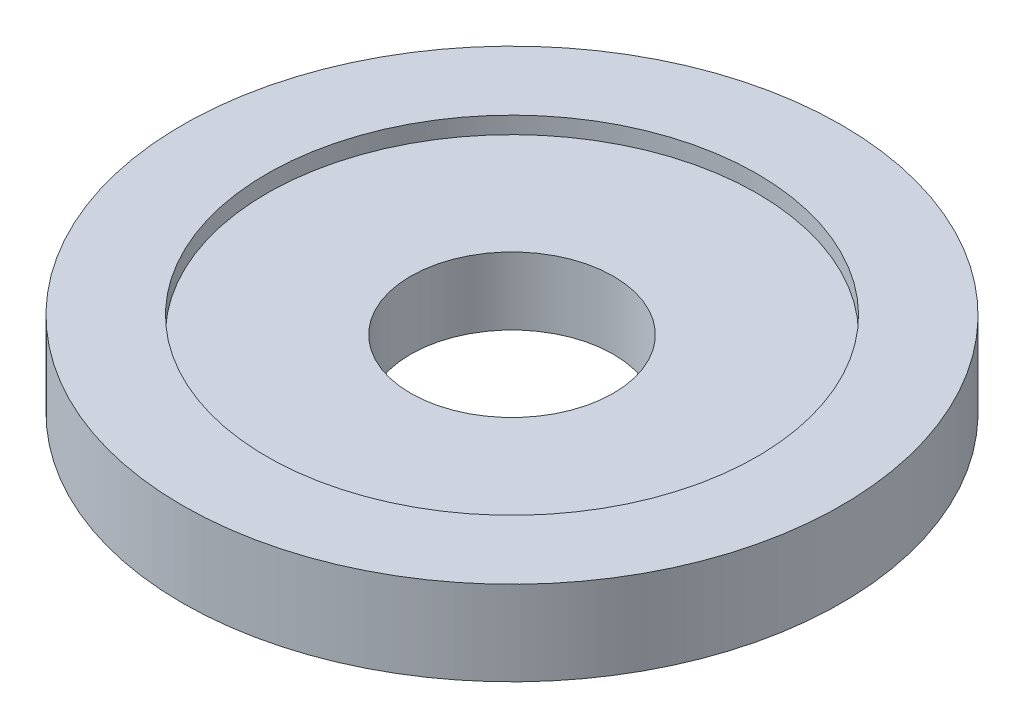
ISO-10303-21;
HEADER;
FILE_DESCRIPTION(('STEP AP214'),'2;1');
FILE_NAME('part.step','',(''),(''),'','','');
FILE_SCHEMA(('AUTOMOTIVE_DESIGN { 1 0 10303 214 1 1 1 1 }'));
ENDSEC;
DATA;
#1=APPLICATION_CONTEXT('core data for automotive mechanical design processes');
#2=APPLICATION_PROTOCOL_DEFINITION('international standard','automotive_design',2000,#1);
#3=PRODUCT_CONTEXT('',#1,'mechanical');
#4=PRODUCT('Part','Part','',(#3));
#5=PRODUCT_RELATED_PRODUCT_CATEGORY('part','',(#4));
#6=PRODUCT_DEFINITION_FORMATION('','',#4);
#7=PRODUCT_DEFINITION_CONTEXT('part definition',#1,'design');
#8=PRODUCT_DEFINITION('design','',#6,#7);
#9=PRODUCT_DEFINITION_SHAPE('','',#8);
#10=(LENGTH_UNIT() NAMED_UNIT(*) SI_UNIT(.MILLI.,.METRE.));
#11=(NAMED_UNIT(*) PLANE_ANGLE_UNIT() SI_UNIT($,.RADIAN.));
#12=(NAMED_UNIT(*) SI_UNIT($,.STERADIAN.) SOLID_ANGLE_UNIT());
#13=UNCERTAINTY_MEASURE_WITH_UNIT(LENGTH_MEASURE(1.E-05),#10,'distance_accuracy_value','');
#14=(GEOMETRIC_REPRESENTATION_CONTEXT(3) GLOBAL_UNCERTAINTY_ASSIGNED_CONTEXT((#13)) GLOBAL_UNIT_ASSIGNED_CONTEXT((#10,
#11,#12)) REPRESENTATION_CONTEXT('',''));
#15=CARTESIAN_POINT('',(0.,0.,0.));
#16=DIRECTION('',(0.,0.,1.));
#17=DIRECTION('',(1.,0.,0.));
#18=AXIS2_PLACEMENT_3D('',#15,#16,#17);
#19=CARTESIAN_POINT('',(39.,0.,0.));
#20=DIRECTION('',(0.,-1.,0.));
#21=DIRECTION('',(0.,0.,-1.));
#22=AXIS2_PLACEMENT_3D('',#19,#20,#21);
#23=PLANE('',#22);
#24=CARTESIAN_POINT('',(0.,0.,0.));
#25=DIRECTION('',(0.,-1.,0.));
#26=DIRECTION('',(0.,0.,-1.));
#27=AXIS2_PLACEMENT_3D('',#24,#25,#26);
#28=CIRCLE('',#27,39.);
#29=CARTESIAN_POINT('',(0.,0.,-39.));
#30=VERTEX_POINT('',#29);
#31=EDGE_CURVE('E53',#30,#30,#28,.T.);
#32=ORIENTED_EDGE('',*,*,#31,.T.);
#33=EDGE_LOOP('',(#32));
#34=FACE_BOUND('',#33,.T.);
#35=CARTESIAN_POINT('',(0.,0.,0.));
#36=DIRECTION('',(0.,-1.,0.));
#37=DIRECTION('',(0.,0.,-1.));
#38=AXIS2_PLACEMENT_3D('',#35,#36,#37);
#39=CIRCLE('',#38,12.);
#40=CARTESIAN_POINT('',(0.,0.,-12.));
#41=VERTEX_POINT('',#40);
#42=EDGE_CURVE('E10',#41,#41,#39,.T.);
#43=ORIENTED_EDGE('',*,*,#42,.F.);
#44=EDGE_LOOP('',(#43));
#45=FACE_BOUND('',#44,.T.);
#46=ADVANCED_FACE('F31',(#34,#45),#23,.T.);
#47=CARTESIAN_POINT('',(0.,0.,0.));
#48=DIRECTION('',(0.,-1.,0.));
#49=DIRECTION('',(0.,0.,-1.));
#50=AXIS2_PLACEMENT_3D('',#47,#48,#49);
#51=CYLINDRICAL_SURFACE('',#50,12.);
#52=ORIENTED_EDGE('',*,*,#42,.T.);
#53=EDGE_LOOP('',(#52));
#54=FACE_BOUND('',#53,.T.);
#55=CARTESIAN_POINT('',(0.,8.,0.));
#56=DIRECTION('',(0.,-1.,0.));
#57=DIRECTION('',(0.,0.,-1.));
#58=AXIS2_PLACEMENT_3D('',#55,#56,#57);
#59=CIRCLE('',#58,12.);
#60=CARTESIAN_POINT('',(0.,8.,-12.));
#61=VERTEX_POINT('',#60);
#62=EDGE_CURVE('E37',#61,#61,#59,.T.);
#63=ORIENTED_EDGE('',*,*,#62,.F.);
#64=EDGE_LOOP('',(#63));
#65=FACE_BOUND('',#64,.T.);
#66=ADVANCED_FACE('F71',(#54,#65),#51,.F.);
#67=CARTESIAN_POINT('',(12.,8.,0.));
#68=DIRECTION('',(0.,1.,0.));
#69=DIRECTION('',(0.,0.,1.));
#70=AXIS2_PLACEMENT_3D('',#67,#68,#69);
#71=PLANE('',#70);
#72=ORIENTED_EDGE('',*,*,#62,.T.);
#73=EDGE_LOOP('',(#72));
#74=FACE_BOUND('',#73,.T.);
#75=CARTESIAN_POINT('',(0.,8.,0.));
#76=DIRECTION('',(0.,-1.,0.));
#77=DIRECTION('',(0.,0.,-1.));
#78=AXIS2_PLACEMENT_3D('',#75,#76,#77);
#79=CIRCLE('',#78,29.);
#80=CARTESIAN_POINT('',(0.,8.,-29.));
#81=VERTEX_POINT('',#80);
#82=EDGE_CURVE('E41',#81,#81,#79,.T.);
#83=ORIENTED_EDGE('',*,*,#82,.F.);
#84=EDGE_LOOP('',(#83));
#85=FACE_BOUND('',#84,.T.);
#86=ADVANCED_FACE('F75',(#74,#85),#71,.T.);
#87=CARTESIAN_POINT('',(0.,0.,0.));
#88=DIRECTION('',(0.,-1.,0.));
#89=DIRECTION('',(0.,0.,-1.));
#90=AXIS2_PLACEMENT_3D('',#87,#88,#89);
#91=CYLINDRICAL_SURFACE('',#90,29.);
#92=ORIENTED_EDGE('',*,*,#82,.T.);
#93=EDGE_LOOP('',(#92));
#94=FACE_BOUND('',#93,.T.);
#95=CARTESIAN_POINT('',(0.,10.,0.));
#96=DIRECTION('',(0.,-1.,0.));
#97=DIRECTION('',(0.,0.,-1.));
#98=AXIS2_PLACEMENT_3D('',#95,#96,#97);
#99=CIRCLE('',#98,29.);
#100=CARTESIAN_POINT('',(0.,10.,-29.));
#101=VERTEX_POINT('',#100);
#102=EDGE_CURVE('E45',#101,#101,#99,.T.);
#103=ORIENTED_EDGE('',*,*,#102,.F.);
#104=EDGE_LOOP('',(#103));
#105=FACE_BOUND('',#104,.T.);
#106=ADVANCED_FACE('F67',(#94,#105),#91,.F.);
#107=CARTESIAN_POINT('',(29.,10.,0.));
#108=DIRECTION('',(0.,1.,0.));
#109=DIRECTION('',(0.,0.,1.));
#110=AXIS2_PLACEMENT_3D('',#107,#108,#109);
#111=PLANE('',#110);
#112=ORIENTED_EDGE('',*,*,#102,.T.);
#113=EDGE_LOOP('',(#112));
#114=FACE_BOUND('',#113,.T.);
#115=CARTESIAN_POINT('',(0.,10.,0.));
#116=DIRECTION('',(0.,-1.,0.));
#117=DIRECTION('',(0.,0.,-1.));
#118=AXIS2_PLACEMENT_3D('',#115,#116,#117);
#119=CIRCLE('',#118,39.);
#120=CARTESIAN_POINT('',(0.,10.,-39.));
#121=VERTEX_POINT('',#120);
#122=EDGE_CURVE('E50',#121,#121,#119,.T.);
#123=ORIENTED_EDGE('',*,*,#122,.F.);
#124=EDGE_LOOP('',(#123));
#125=FACE_BOUND('',#124,.T.);
#126=ADVANCED_FACE('F61',(#114,#125),#111,.T.);
#127=CARTESIAN_POINT('',(0.,0.,0.));
#128=DIRECTION('',(0.,-1.,0.));
#129=DIRECTION('',(0.,0.,-1.));
#130=AXIS2_PLACEMENT_3D('',#127,#128,#129);
#131=CYLINDRICAL_SURFACE('',#130,39.);
#132=ORIENTED_EDGE('',*,*,#122,.T.);
#133=EDGE_LOOP('',(#132));
#134=FACE_BOUND('',#133,.T.);
#135=ORIENTED_EDGE('',*,*,#31,.F.);
#136=EDGE_LOOP('',(#135));
#137=FACE_BOUND('',#136,.T.);
#138=ADVANCED_FACE('F59',(#134,#137),#131,.T.);
#139=CLOSED_SHELL('',(#46,#66,#86,#106,#126,#138));
#140=MANIFOLD_SOLID_BREP('B2',#139);
#141=ADVANCED_BREP_SHAPE_REPRESENTATION('',(#18,#140),#14);
#142=SHAPE_DEFINITION_REPRESENTATION(#9,#141);
ENDSEC;
END-ISO-10303-21;
